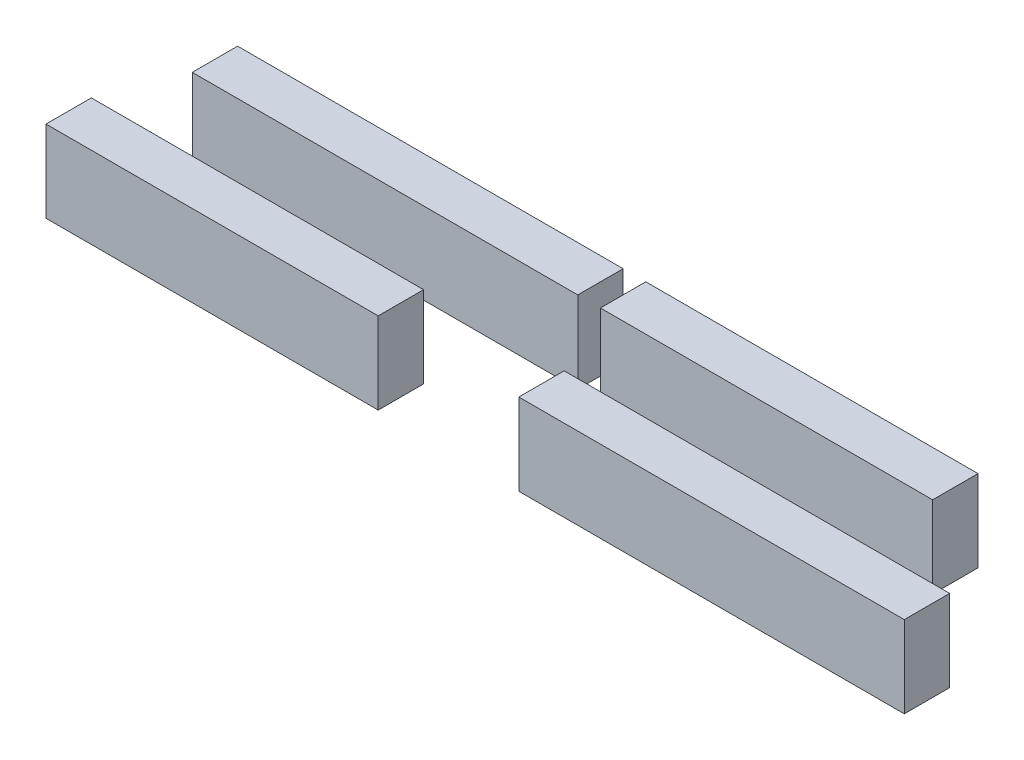
ISO-10303-21;
HEADER;
FILE_DESCRIPTION(('STEP AP214'),'2;1');
FILE_NAME('part.step','',(''),(''),'','','');
FILE_SCHEMA(('AUTOMOTIVE_DESIGN { 1 0 10303 214 1 1 1 1 }'));
ENDSEC;
DATA;
#1=APPLICATION_CONTEXT('core data for automotive mechanical design processes');
#2=APPLICATION_PROTOCOL_DEFINITION('international standard','automotive_design',2000,#1);
#3=PRODUCT_CONTEXT('',#1,'mechanical');
#4=PRODUCT('Part','Part','',(#3));
#5=PRODUCT_RELATED_PRODUCT_CATEGORY('part','',(#4));
#6=PRODUCT_DEFINITION_FORMATION('','',#4);
#7=PRODUCT_DEFINITION_CONTEXT('part definition',#1,'design');
#8=PRODUCT_DEFINITION('design','',#6,#7);
#9=PRODUCT_DEFINITION_SHAPE('','',#8);
#10=(LENGTH_UNIT() NAMED_UNIT(*) SI_UNIT(.MILLI.,.METRE.));
#11=(NAMED_UNIT(*) PLANE_ANGLE_UNIT() SI_UNIT($,.RADIAN.));
#12=(NAMED_UNIT(*) SI_UNIT($,.STERADIAN.) SOLID_ANGLE_UNIT());
#13=UNCERTAINTY_MEASURE_WITH_UNIT(LENGTH_MEASURE(1.E-05),#10,'distance_accuracy_value','');
#14=(GEOMETRIC_REPRESENTATION_CONTEXT(3) GLOBAL_UNCERTAINTY_ASSIGNED_CONTEXT((#13)) GLOBAL_UNIT_ASSIGNED_CONTEXT((#10,
#11,#12)) REPRESENTATION_CONTEXT('',''));
#15=CARTESIAN_POINT('',(0.,0.,0.));
#16=DIRECTION('',(0.,0.,1.));
#17=DIRECTION('',(1.,0.,0.));
#18=AXIS2_PLACEMENT_3D('',#15,#16,#17);
#19=CARTESIAN_POINT('',(50.75,9.,-22.5));
#20=DIRECTION('',(1.,0.,0.));
#21=DIRECTION('',(0.,0.,-1.));
#22=AXIS2_PLACEMENT_3D('',#19,#20,#21);
#23=PLANE('',#22);
#24=DIRECTION('',(0.,0.,1.));
#25=VECTOR('',#24,1.);
#26=CARTESIAN_POINT('',(50.75,0.,-22.5));
#27=LINE('',#26,#25);
#28=CARTESIAN_POINT('',(50.75,0.,-22.5));
#29=VERTEX_POINT('',#28);
#30=CARTESIAN_POINT('',(50.75,0.,-17.5));
#31=VERTEX_POINT('',#30);
#32=EDGE_CURVE('E107',#29,#31,#27,.T.);
#33=ORIENTED_EDGE('',*,*,#32,.T.);
#34=DIRECTION('',(0.,-1.,0.));
#35=VECTOR('',#34,1.);
#36=CARTESIAN_POINT('',(50.75,9.,-17.5));
#37=LINE('',#36,#35);
#38=CARTESIAN_POINT('',(50.75,9.,-17.5));
#39=VERTEX_POINT('',#38);
#40=EDGE_CURVE('E12',#39,#31,#37,.T.);
#41=ORIENTED_EDGE('',*,*,#40,.F.);
#42=DIRECTION('',(0.,0.,1.));
#43=VECTOR('',#42,1.);
#44=CARTESIAN_POINT('',(50.75,9.,-22.5));
#45=LINE('',#44,#43);
#46=CARTESIAN_POINT('',(50.75,9.,-22.5));
#47=VERTEX_POINT('',#46);
#48=EDGE_CURVE('E95',#47,#39,#45,.T.);
#49=ORIENTED_EDGE('',*,*,#48,.F.);
#50=DIRECTION('',(0.,-1.,0.));
#51=VECTOR('',#50,1.);
#52=CARTESIAN_POINT('',(50.75,9.,-22.5));
#53=LINE('',#52,#51);
#54=EDGE_CURVE('E103',#47,#29,#53,.T.);
#55=ORIENTED_EDGE('',*,*,#54,.T.);
#56=EDGE_LOOP('',(#33,#41,#49,#55));
#57=FACE_BOUND('',#56,.T.);
#58=ADVANCED_FACE('F44',(#57),#23,.F.);
#59=CARTESIAN_POINT('',(50.75,9.,-17.5));
#60=DIRECTION('',(0.,0.,-1.));
#61=DIRECTION('',(-1.,0.,0.));
#62=AXIS2_PLACEMENT_3D('',#59,#60,#61);
#63=PLANE('',#62);
#64=DIRECTION('',(1.,0.,0.));
#65=VECTOR('',#64,1.);
#66=CARTESIAN_POINT('',(50.75,0.,-17.5));
#67=LINE('',#66,#65);
#68=CARTESIAN_POINT('',(87.375,0.,-17.5));
#69=VERTEX_POINT('',#68);
#70=EDGE_CURVE('E99',#31,#69,#67,.T.);
#71=ORIENTED_EDGE('',*,*,#70,.T.);
#72=DIRECTION('',(0.,-1.,0.));
#73=VECTOR('',#72,1.);
#74=CARTESIAN_POINT('',(87.375,9.,-17.5));
#75=LINE('',#74,#73);
#76=CARTESIAN_POINT('',(87.375,9.,-17.5));
#77=VERTEX_POINT('',#76);
#78=EDGE_CURVE('E52',#77,#69,#75,.T.);
#79=ORIENTED_EDGE('',*,*,#78,.F.);
#80=DIRECTION('',(1.,0.,0.));
#81=VECTOR('',#80,1.);
#82=CARTESIAN_POINT('',(50.75,9.,-17.5));
#83=LINE('',#82,#81);
#84=EDGE_CURVE('E90',#39,#77,#83,.T.);
#85=ORIENTED_EDGE('',*,*,#84,.F.);
#86=ORIENTED_EDGE('',*,*,#40,.T.);
#87=EDGE_LOOP('',(#71,#79,#85,#86));
#88=FACE_BOUND('',#87,.T.);
#89=ADVANCED_FACE('F98',(#88),#63,.F.);
#90=CARTESIAN_POINT('',(87.375,9.,-22.5));
#91=DIRECTION('',(-1.,0.,0.));
#92=DIRECTION('',(0.,0.,1.));
#93=AXIS2_PLACEMENT_3D('',#90,#91,#92);
#94=PLANE('',#93);
#95=DIRECTION('',(0.,0.,-1.));
#96=VECTOR('',#95,1.);
#97=CARTESIAN_POINT('',(87.375,0.,-22.5));
#98=LINE('',#97,#96);
#99=CARTESIAN_POINT('',(87.375,0.,-22.5));
#100=VERTEX_POINT('',#99);
#101=EDGE_CURVE('E77',#69,#100,#98,.T.);
#102=ORIENTED_EDGE('',*,*,#101,.T.);
#103=DIRECTION('',(0.,-1.,0.));
#104=VECTOR('',#103,1.);
#105=CARTESIAN_POINT('',(87.375,9.,-22.5));
#106=LINE('',#105,#104);
#107=CARTESIAN_POINT('',(87.375,9.,-22.5));
#108=VERTEX_POINT('',#107);
#109=EDGE_CURVE('E100',#108,#100,#106,.T.);
#110=ORIENTED_EDGE('',*,*,#109,.F.);
#111=DIRECTION('',(0.,0.,-1.));
#112=VECTOR('',#111,1.);
#113=CARTESIAN_POINT('',(87.375,9.,-22.5));
#114=LINE('',#113,#112);
#115=EDGE_CURVE('E93',#77,#108,#114,.T.);
#116=ORIENTED_EDGE('',*,*,#115,.F.);
#117=ORIENTED_EDGE('',*,*,#78,.T.);
#118=EDGE_LOOP('',(#102,#110,#116,#117));
#119=FACE_BOUND('',#118,.T.);
#120=ADVANCED_FACE('F101',(#119),#94,.F.);
#121=CARTESIAN_POINT('',(50.75,9.,-22.5));
#122=DIRECTION('',(0.,0.,1.));
#123=DIRECTION('',(1.,0.,0.));
#124=AXIS2_PLACEMENT_3D('',#121,#122,#123);
#125=PLANE('',#124);
#126=DIRECTION('',(-1.,0.,0.));
#127=VECTOR('',#126,1.);
#128=CARTESIAN_POINT('',(50.75,0.,-22.5));
#129=LINE('',#128,#127);
#130=EDGE_CURVE('E83',#100,#29,#129,.T.);
#131=ORIENTED_EDGE('',*,*,#130,.T.);
#132=ORIENTED_EDGE('',*,*,#54,.F.);
#133=DIRECTION('',(-1.,0.,0.));
#134=VECTOR('',#133,1.);
#135=CARTESIAN_POINT('',(50.75,9.,-22.5));
#136=LINE('',#135,#134);
#137=EDGE_CURVE('E60',#108,#47,#136,.T.);
#138=ORIENTED_EDGE('',*,*,#137,.F.);
#139=ORIENTED_EDGE('',*,*,#109,.T.);
#140=EDGE_LOOP('',(#131,#132,#138,#139));
#141=FACE_BOUND('',#140,.T.);
#142=ADVANCED_FACE('F114',(#141),#125,.F.);
#143=CARTESIAN_POINT('',(50.75,9.,-17.5));
#144=DIRECTION('',(0.,1.,0.));
#145=DIRECTION('',(0.,0.,1.));
#146=AXIS2_PLACEMENT_3D('',#143,#144,#145);
#147=PLANE('',#146);
#148=ORIENTED_EDGE('',*,*,#48,.T.);
#149=ORIENTED_EDGE('',*,*,#84,.T.);
#150=ORIENTED_EDGE('',*,*,#115,.T.);
#151=ORIENTED_EDGE('',*,*,#137,.T.);
#152=EDGE_LOOP('',(#148,#149,#150,#151));
#153=FACE_BOUND('',#152,.T.);
#154=ADVANCED_FACE('F91',(#153),#147,.T.);
#155=CARTESIAN_POINT('',(50.75,0.,-17.5));
#156=DIRECTION('',(0.,1.,0.));
#157=DIRECTION('',(0.,0.,1.));
#158=AXIS2_PLACEMENT_3D('',#155,#156,#157);
#159=PLANE('',#158);
#160=ORIENTED_EDGE('',*,*,#32,.F.);
#161=ORIENTED_EDGE('',*,*,#130,.F.);
#162=ORIENTED_EDGE('',*,*,#101,.F.);
#163=ORIENTED_EDGE('',*,*,#70,.F.);
#164=EDGE_LOOP('',(#160,#161,#162,#163));
#165=FACE_BOUND('',#164,.T.);
#166=ADVANCED_FACE('F117',(#165),#159,.F.);
#167=CLOSED_SHELL('',(#58,#89,#120,#142,#154,#166));
#168=MANIFOLD_SOLID_BREP('B2',#167);
#169=CARTESIAN_POINT('',(5.75,9.,-22.5));
#170=DIRECTION('',(1.,0.,0.));
#171=DIRECTION('',(0.,0.,-1.));
#172=AXIS2_PLACEMENT_3D('',#169,#170,#171);
#173=PLANE('',#172);
#174=DIRECTION('',(0.,0.,1.));
#175=VECTOR('',#174,1.);
#176=CARTESIAN_POINT('',(5.75,0.,-22.5));
#177=LINE('',#176,#175);
#178=CARTESIAN_POINT('',(5.75,0.,-22.5));
#179=VERTEX_POINT('',#178);
#180=CARTESIAN_POINT('',(5.75,0.,-17.5));
#181=VERTEX_POINT('',#180);
#182=EDGE_CURVE('E241',#179,#181,#177,.T.);
#183=ORIENTED_EDGE('',*,*,#182,.T.);
#184=DIRECTION('',(0.,-1.,0.));
#185=VECTOR('',#184,1.);
#186=CARTESIAN_POINT('',(5.75,9.,-17.5));
#187=LINE('',#186,#185);
#188=CARTESIAN_POINT('',(5.75,9.,-17.5));
#189=VERTEX_POINT('',#188);
#190=EDGE_CURVE('E42',#189,#181,#187,.T.);
#191=ORIENTED_EDGE('',*,*,#190,.F.);
#192=DIRECTION('',(0.,0.,1.));
#193=VECTOR('',#192,1.);
#194=CARTESIAN_POINT('',(5.75,9.,-22.5));
#195=LINE('',#194,#193);
#196=CARTESIAN_POINT('',(5.75,9.,-22.5));
#197=VERTEX_POINT('',#196);
#198=EDGE_CURVE('E229',#197,#189,#195,.T.);
#199=ORIENTED_EDGE('',*,*,#198,.F.);
#200=DIRECTION('',(0.,-1.,0.));
#201=VECTOR('',#200,1.);
#202=CARTESIAN_POINT('',(5.75,9.,-22.5));
#203=LINE('',#202,#201);
#204=EDGE_CURVE('E237',#197,#179,#203,.T.);
#205=ORIENTED_EDGE('',*,*,#204,.T.);
#206=EDGE_LOOP('',(#183,#191,#199,#205));
#207=FACE_BOUND('',#206,.T.);
#208=ADVANCED_FACE('F178',(#207),#173,.F.);
#209=CARTESIAN_POINT('',(5.75,9.,-17.5));
#210=DIRECTION('',(0.,0.,-1.));
#211=DIRECTION('',(-1.,0.,0.));
#212=AXIS2_PLACEMENT_3D('',#209,#210,#211);
#213=PLANE('',#212);
#214=DIRECTION('',(1.,0.,0.));
#215=VECTOR('',#214,1.);
#216=CARTESIAN_POINT('',(5.75,0.,-17.5));
#217=LINE('',#216,#215);
#218=CARTESIAN_POINT('',(48.25,0.,-17.5));
#219=VERTEX_POINT('',#218);
#220=EDGE_CURVE('E233',#181,#219,#217,.T.);
#221=ORIENTED_EDGE('',*,*,#220,.T.);
#222=DIRECTION('',(0.,-1.,0.));
#223=VECTOR('',#222,1.);
#224=CARTESIAN_POINT('',(48.25,9.,-17.5));
#225=LINE('',#224,#223);
#226=CARTESIAN_POINT('',(48.25,9.,-17.5));
#227=VERTEX_POINT('',#226);
#228=EDGE_CURVE('E186',#227,#219,#225,.T.);
#229=ORIENTED_EDGE('',*,*,#228,.F.);
#230=DIRECTION('',(1.,0.,0.));
#231=VECTOR('',#230,1.);
#232=CARTESIAN_POINT('',(5.75,9.,-17.5));
#233=LINE('',#232,#231);
#234=EDGE_CURVE('E224',#189,#227,#233,.T.);
#235=ORIENTED_EDGE('',*,*,#234,.F.);
#236=ORIENTED_EDGE('',*,*,#190,.T.);
#237=EDGE_LOOP('',(#221,#229,#235,#236));
#238=FACE_BOUND('',#237,.T.);
#239=ADVANCED_FACE('F232',(#238),#213,.F.);
#240=CARTESIAN_POINT('',(48.25,9.,-22.5));
#241=DIRECTION('',(-1.,0.,0.));
#242=DIRECTION('',(0.,0.,1.));
#243=AXIS2_PLACEMENT_3D('',#240,#241,#242);
#244=PLANE('',#243);
#245=DIRECTION('',(0.,0.,-1.));
#246=VECTOR('',#245,1.);
#247=CARTESIAN_POINT('',(48.25,0.,-22.5));
#248=LINE('',#247,#246);
#249=CARTESIAN_POINT('',(48.25,0.,-22.5));
#250=VERTEX_POINT('',#249);
#251=EDGE_CURVE('E211',#219,#250,#248,.T.);
#252=ORIENTED_EDGE('',*,*,#251,.T.);
#253=DIRECTION('',(0.,-1.,0.));
#254=VECTOR('',#253,1.);
#255=CARTESIAN_POINT('',(48.25,9.,-22.5));
#256=LINE('',#255,#254);
#257=CARTESIAN_POINT('',(48.25,9.,-22.5));
#258=VERTEX_POINT('',#257);
#259=EDGE_CURVE('E234',#258,#250,#256,.T.);
#260=ORIENTED_EDGE('',*,*,#259,.F.);
#261=DIRECTION('',(0.,0.,-1.));
#262=VECTOR('',#261,1.);
#263=CARTESIAN_POINT('',(48.25,9.,-22.5));
#264=LINE('',#263,#262);
#265=EDGE_CURVE('E227',#227,#258,#264,.T.);
#266=ORIENTED_EDGE('',*,*,#265,.F.);
#267=ORIENTED_EDGE('',*,*,#228,.T.);
#268=EDGE_LOOP('',(#252,#260,#266,#267));
#269=FACE_BOUND('',#268,.T.);
#270=ADVANCED_FACE('F235',(#269),#244,.F.);
#271=CARTESIAN_POINT('',(5.75,9.,-22.5));
#272=DIRECTION('',(0.,0.,1.));
#273=DIRECTION('',(1.,0.,0.));
#274=AXIS2_PLACEMENT_3D('',#271,#272,#273);
#275=PLANE('',#274);
#276=DIRECTION('',(-1.,0.,0.));
#277=VECTOR('',#276,1.);
#278=CARTESIAN_POINT('',(5.75,0.,-22.5));
#279=LINE('',#278,#277);
#280=EDGE_CURVE('E217',#250,#179,#279,.T.);
#281=ORIENTED_EDGE('',*,*,#280,.T.);
#282=ORIENTED_EDGE('',*,*,#204,.F.);
#283=DIRECTION('',(-1.,0.,0.));
#284=VECTOR('',#283,1.);
#285=CARTESIAN_POINT('',(5.75,9.,-22.5));
#286=LINE('',#285,#284);
#287=EDGE_CURVE('E194',#258,#197,#286,.T.);
#288=ORIENTED_EDGE('',*,*,#287,.F.);
#289=ORIENTED_EDGE('',*,*,#259,.T.);
#290=EDGE_LOOP('',(#281,#282,#288,#289));
#291=FACE_BOUND('',#290,.T.);
#292=ADVANCED_FACE('F248',(#291),#275,.F.);
#293=CARTESIAN_POINT('',(5.75,9.,-17.5));
#294=DIRECTION('',(0.,1.,0.));
#295=DIRECTION('',(0.,0.,1.));
#296=AXIS2_PLACEMENT_3D('',#293,#294,#295);
#297=PLANE('',#296);
#298=ORIENTED_EDGE('',*,*,#198,.T.);
#299=ORIENTED_EDGE('',*,*,#234,.T.);
#300=ORIENTED_EDGE('',*,*,#265,.T.);
#301=ORIENTED_EDGE('',*,*,#287,.T.);
#302=EDGE_LOOP('',(#298,#299,#300,#301));
#303=FACE_BOUND('',#302,.T.);
#304=ADVANCED_FACE('F225',(#303),#297,.T.);
#305=CARTESIAN_POINT('',(5.75,0.,-17.5));
#306=DIRECTION('',(0.,1.,0.));
#307=DIRECTION('',(0.,0.,1.));
#308=AXIS2_PLACEMENT_3D('',#305,#306,#307);
#309=PLANE('',#308);
#310=ORIENTED_EDGE('',*,*,#182,.F.);
#311=ORIENTED_EDGE('',*,*,#280,.F.);
#312=ORIENTED_EDGE('',*,*,#251,.F.);
#313=ORIENTED_EDGE('',*,*,#220,.F.);
#314=EDGE_LOOP('',(#310,#311,#312,#313));
#315=FACE_BOUND('',#314,.T.);
#316=ADVANCED_FACE('F251',(#315),#309,.F.);
#317=CLOSED_SHELL('',(#208,#239,#270,#292,#304,#316));
#318=MANIFOLD_SOLID_BREP('B6',#317);
#319=CARTESIAN_POINT('',(54.75,9.,-9.5));
#320=DIRECTION('',(1.,0.,0.));
#321=DIRECTION('',(0.,0.,-1.));
#322=AXIS2_PLACEMENT_3D('',#319,#320,#321);
#323=PLANE('',#322);
#324=DIRECTION('',(0.,0.,1.));
#325=VECTOR('',#324,1.);
#326=CARTESIAN_POINT('',(54.75,0.,-9.5));
#327=LINE('',#326,#325);
#328=CARTESIAN_POINT('',(54.75,0.,-9.5));
#329=VERTEX_POINT('',#328);
#330=CARTESIAN_POINT('',(54.75,0.,-4.5));
#331=VERTEX_POINT('',#330);
#332=EDGE_CURVE('E374',#329,#331,#327,.T.);
#333=ORIENTED_EDGE('',*,*,#332,.T.);
#334=DIRECTION('',(0.,-1.,0.));
#335=VECTOR('',#334,1.);
#336=CARTESIAN_POINT('',(54.75,9.,-4.5));
#337=LINE('',#336,#335);
#338=CARTESIAN_POINT('',(54.75,9.,-4.5));
#339=VERTEX_POINT('',#338);
#340=EDGE_CURVE('E176',#339,#331,#337,.T.);
#341=ORIENTED_EDGE('',*,*,#340,.F.);
#342=DIRECTION('',(0.,0.,1.));
#343=VECTOR('',#342,1.);
#344=CARTESIAN_POINT('',(54.75,9.,-9.5));
#345=LINE('',#344,#343);
#346=CARTESIAN_POINT('',(54.75,9.,-9.5));
#347=VERTEX_POINT('',#346);
#348=EDGE_CURVE('E362',#347,#339,#345,.T.);
#349=ORIENTED_EDGE('',*,*,#348,.F.);
#350=DIRECTION('',(0.,-1.,0.));
#351=VECTOR('',#350,1.);
#352=CARTESIAN_POINT('',(54.75,9.,-9.5));
#353=LINE('',#352,#351);
#354=EDGE_CURVE('E370',#347,#329,#353,.T.);
#355=ORIENTED_EDGE('',*,*,#354,.T.);
#356=EDGE_LOOP('',(#333,#341,#349,#355));
#357=FACE_BOUND('',#356,.T.);
#358=ADVANCED_FACE('F311',(#357),#323,.F.);
#359=CARTESIAN_POINT('',(54.75,9.,-4.5));
#360=DIRECTION('',(0.,0.,-1.));
#361=DIRECTION('',(-1.,0.,0.));
#362=AXIS2_PLACEMENT_3D('',#359,#360,#361);
#363=PLANE('',#362);
#364=DIRECTION('',(1.,0.,0.));
#365=VECTOR('',#364,1.);
#366=CARTESIAN_POINT('',(54.75,0.,-4.5));
#367=LINE('',#366,#365);
#368=CARTESIAN_POINT('',(97.25,0.,-4.5));
#369=VERTEX_POINT('',#368);
#370=EDGE_CURVE('E366',#331,#369,#367,.T.);
#371=ORIENTED_EDGE('',*,*,#370,.T.);
#372=DIRECTION('',(0.,-1.,0.));
#373=VECTOR('',#372,1.);
#374=CARTESIAN_POINT('',(97.25,9.,-4.5));
#375=LINE('',#374,#373);
#376=CARTESIAN_POINT('',(97.25,9.,-4.5));
#377=VERTEX_POINT('',#376);
#378=EDGE_CURVE('E319',#377,#369,#375,.T.);
#379=ORIENTED_EDGE('',*,*,#378,.F.);
#380=DIRECTION('',(1.,0.,0.));
#381=VECTOR('',#380,1.);
#382=CARTESIAN_POINT('',(54.75,9.,-4.5));
#383=LINE('',#382,#381);
#384=EDGE_CURVE('E357',#339,#377,#383,.T.);
#385=ORIENTED_EDGE('',*,*,#384,.F.);
#386=ORIENTED_EDGE('',*,*,#340,.T.);
#387=EDGE_LOOP('',(#371,#379,#385,#386));
#388=FACE_BOUND('',#387,.T.);
#389=ADVANCED_FACE('F365',(#388),#363,.F.);
#390=CARTESIAN_POINT('',(97.25,9.,-9.5));
#391=DIRECTION('',(-1.,0.,0.));
#392=DIRECTION('',(0.,0.,1.));
#393=AXIS2_PLACEMENT_3D('',#390,#391,#392);
#394=PLANE('',#393);
#395=DIRECTION('',(0.,0.,-1.));
#396=VECTOR('',#395,1.);
#397=CARTESIAN_POINT('',(97.25,0.,-9.5));
#398=LINE('',#397,#396);
#399=CARTESIAN_POINT('',(97.25,0.,-9.5));
#400=VERTEX_POINT('',#399);
#401=EDGE_CURVE('E344',#369,#400,#398,.T.);
#402=ORIENTED_EDGE('',*,*,#401,.T.);
#403=DIRECTION('',(0.,-1.,0.));
#404=VECTOR('',#403,1.);
#405=CARTESIAN_POINT('',(97.25,9.,-9.5));
#406=LINE('',#405,#404);
#407=CARTESIAN_POINT('',(97.25,9.,-9.5));
#408=VERTEX_POINT('',#407);
#409=EDGE_CURVE('E367',#408,#400,#406,.T.);
#410=ORIENTED_EDGE('',*,*,#409,.F.);
#411=DIRECTION('',(0.,0.,-1.));
#412=VECTOR('',#411,1.);
#413=CARTESIAN_POINT('',(97.25,9.,-9.5));
#414=LINE('',#413,#412);
#415=EDGE_CURVE('E360',#377,#408,#414,.T.);
#416=ORIENTED_EDGE('',*,*,#415,.F.);
#417=ORIENTED_EDGE('',*,*,#378,.T.);
#418=EDGE_LOOP('',(#402,#410,#416,#417));
#419=FACE_BOUND('',#418,.T.);
#420=ADVANCED_FACE('F368',(#419),#394,.F.);
#421=CARTESIAN_POINT('',(54.75,9.,-9.5));
#422=DIRECTION('',(0.,0.,1.));
#423=DIRECTION('',(1.,0.,0.));
#424=AXIS2_PLACEMENT_3D('',#421,#422,#423);
#425=PLANE('',#424);
#426=DIRECTION('',(-1.,0.,0.));
#427=VECTOR('',#426,1.);
#428=CARTESIAN_POINT('',(54.75,0.,-9.5));
#429=LINE('',#428,#427);
#430=EDGE_CURVE('E350',#400,#329,#429,.T.);
#431=ORIENTED_EDGE('',*,*,#430,.T.);
#432=ORIENTED_EDGE('',*,*,#354,.F.);
#433=DIRECTION('',(-1.,0.,0.));
#434=VECTOR('',#433,1.);
#435=CARTESIAN_POINT('',(54.75,9.,-9.5));
#436=LINE('',#435,#434);
#437=EDGE_CURVE('E327',#408,#347,#436,.T.);
#438=ORIENTED_EDGE('',*,*,#437,.F.);
#439=ORIENTED_EDGE('',*,*,#409,.T.);
#440=EDGE_LOOP('',(#431,#432,#438,#439));
#441=FACE_BOUND('',#440,.T.);
#442=ADVANCED_FACE('F381',(#441),#425,.F.);
#443=CARTESIAN_POINT('',(54.75,9.,-4.5));
#444=DIRECTION('',(0.,1.,0.));
#445=DIRECTION('',(0.,0.,1.));
#446=AXIS2_PLACEMENT_3D('',#443,#444,#445);
#447=PLANE('',#446);
#448=ORIENTED_EDGE('',*,*,#348,.T.);
#449=ORIENTED_EDGE('',*,*,#384,.T.);
#450=ORIENTED_EDGE('',*,*,#415,.T.);
#451=ORIENTED_EDGE('',*,*,#437,.T.);
#452=EDGE_LOOP('',(#448,#449,#450,#451));
#453=FACE_BOUND('',#452,.T.);
#454=ADVANCED_FACE('F358',(#453),#447,.T.);
#455=CARTESIAN_POINT('',(54.75,0.,-4.5));
#456=DIRECTION('',(0.,1.,0.));
#457=DIRECTION('',(0.,0.,1.));
#458=AXIS2_PLACEMENT_3D('',#455,#456,#457);
#459=PLANE('',#458);
#460=ORIENTED_EDGE('',*,*,#332,.F.);
#461=ORIENTED_EDGE('',*,*,#430,.F.);
#462=ORIENTED_EDGE('',*,*,#401,.F.);
#463=ORIENTED_EDGE('',*,*,#370,.F.);
#464=EDGE_LOOP('',(#460,#461,#462,#463));
#465=FACE_BOUND('',#464,.T.);
#466=ADVANCED_FACE('F384',(#465),#459,.F.);
#467=CLOSED_SHELL('',(#358,#389,#420,#442,#454,#466));
#468=MANIFOLD_SOLID_BREP('B36',#467);
#469=CARTESIAN_POINT('',(2.625,9.,-9.5));
#470=DIRECTION('',(1.,0.,0.));
#471=DIRECTION('',(0.,0.,-1.));
#472=AXIS2_PLACEMENT_3D('',#469,#470,#471);
#473=PLANE('',#472);
#474=DIRECTION('',(0.,0.,1.));
#475=VECTOR('',#474,1.);
#476=CARTESIAN_POINT('',(2.625,0.,-9.5));
#477=LINE('',#476,#475);
#478=CARTESIAN_POINT('',(2.625,0.,-9.5));
#479=VERTEX_POINT('',#478);
#480=CARTESIAN_POINT('',(2.625,0.,-4.5));
#481=VERTEX_POINT('',#480);
#482=EDGE_CURVE('E498',#479,#481,#477,.T.);
#483=ORIENTED_EDGE('',*,*,#482,.T.);
#484=DIRECTION('',(0.,-1.,0.));
#485=VECTOR('',#484,1.);
#486=CARTESIAN_POINT('',(2.625,9.,-4.5));
#487=LINE('',#486,#485);
#488=CARTESIAN_POINT('',(2.625,9.,-4.5));
#489=VERTEX_POINT('',#488);
#490=EDGE_CURVE('E309',#489,#481,#487,.T.);
#491=ORIENTED_EDGE('',*,*,#490,.F.);
#492=DIRECTION('',(0.,0.,1.));
#493=VECTOR('',#492,1.);
#494=CARTESIAN_POINT('',(2.625,9.,-9.5));
#495=LINE('',#494,#493);
#496=CARTESIAN_POINT('',(2.625,9.,-9.5));
#497=VERTEX_POINT('',#496);
#498=EDGE_CURVE('E486',#497,#489,#495,.T.);
#499=ORIENTED_EDGE('',*,*,#498,.F.);
#500=DIRECTION('',(0.,-1.,0.));
#501=VECTOR('',#500,1.);
#502=CARTESIAN_POINT('',(2.625,9.,-9.5));
#503=LINE('',#502,#501);
#504=EDGE_CURVE('E494',#497,#479,#503,.T.);
#505=ORIENTED_EDGE('',*,*,#504,.T.);
#506=EDGE_LOOP('',(#483,#491,#499,#505));
#507=FACE_BOUND('',#506,.T.);
#508=ADVANCED_FACE('F435',(#507),#473,.F.);
#509=CARTESIAN_POINT('',(2.625,9.,-4.5));
#510=DIRECTION('',(0.,0.,-1.));
#511=DIRECTION('',(-1.,0.,0.));
#512=AXIS2_PLACEMENT_3D('',#509,#510,#511);
#513=PLANE('',#512);
#514=DIRECTION('',(1.,0.,0.));
#515=VECTOR('',#514,1.);
#516=CARTESIAN_POINT('',(2.625,0.,-4.5));
#517=LINE('',#516,#515);
#518=CARTESIAN_POINT('',(39.25,0.,-4.5));
#519=VERTEX_POINT('',#518);
#520=EDGE_CURVE('E490',#481,#519,#517,.T.);
#521=ORIENTED_EDGE('',*,*,#520,.T.);
#522=DIRECTION('',(0.,-1.,0.));
#523=VECTOR('',#522,1.);
#524=CARTESIAN_POINT('',(39.25,9.,-4.5));
#525=LINE('',#524,#523);
#526=CARTESIAN_POINT('',(39.25,9.,-4.5));
#527=VERTEX_POINT('',#526);
#528=EDGE_CURVE('E443',#527,#519,#525,.T.);
#529=ORIENTED_EDGE('',*,*,#528,.F.);
#530=DIRECTION('',(1.,0.,0.));
#531=VECTOR('',#530,1.);
#532=CARTESIAN_POINT('',(2.625,9.,-4.5));
#533=LINE('',#532,#531);
#534=EDGE_CURVE('E481',#489,#527,#533,.T.);
#535=ORIENTED_EDGE('',*,*,#534,.F.);
#536=ORIENTED_EDGE('',*,*,#490,.T.);
#537=EDGE_LOOP('',(#521,#529,#535,#536));
#538=FACE_BOUND('',#537,.T.);
#539=ADVANCED_FACE('F489',(#538),#513,.F.);
#540=CARTESIAN_POINT('',(39.25,9.,-9.5));
#541=DIRECTION('',(-1.,0.,0.));
#542=DIRECTION('',(0.,0.,1.));
#543=AXIS2_PLACEMENT_3D('',#540,#541,#542);
#544=PLANE('',#543);
#545=DIRECTION('',(0.,0.,-1.));
#546=VECTOR('',#545,1.);
#547=CARTESIAN_POINT('',(39.25,0.,-9.5));
#548=LINE('',#547,#546);
#549=CARTESIAN_POINT('',(39.25,0.,-9.5));
#550=VERTEX_POINT('',#549);
#551=EDGE_CURVE('E468',#519,#550,#548,.T.);
#552=ORIENTED_EDGE('',*,*,#551,.T.);
#553=DIRECTION('',(0.,-1.,0.));
#554=VECTOR('',#553,1.);
#555=CARTESIAN_POINT('',(39.25,9.,-9.5));
#556=LINE('',#555,#554);
#557=CARTESIAN_POINT('',(39.25,9.,-9.5));
#558=VERTEX_POINT('',#557);
#559=EDGE_CURVE('E491',#558,#550,#556,.T.);
#560=ORIENTED_EDGE('',*,*,#559,.F.);
#561=DIRECTION('',(0.,0.,-1.));
#562=VECTOR('',#561,1.);
#563=CARTESIAN_POINT('',(39.25,9.,-9.5));
#564=LINE('',#563,#562);
#565=EDGE_CURVE('E484',#527,#558,#564,.T.);
#566=ORIENTED_EDGE('',*,*,#565,.F.);
#567=ORIENTED_EDGE('',*,*,#528,.T.);
#568=EDGE_LOOP('',(#552,#560,#566,#567));
#569=FACE_BOUND('',#568,.T.);
#570=ADVANCED_FACE('F492',(#569),#544,.F.);
#571=CARTESIAN_POINT('',(2.625,9.,-9.5));
#572=DIRECTION('',(0.,0.,1.));
#573=DIRECTION('',(1.,0.,0.));
#574=AXIS2_PLACEMENT_3D('',#571,#572,#573);
#575=PLANE('',#574);
#576=DIRECTION('',(-1.,0.,0.));
#577=VECTOR('',#576,1.);
#578=CARTESIAN_POINT('',(2.625,0.,-9.5));
#579=LINE('',#578,#577);
#580=EDGE_CURVE('E474',#550,#479,#579,.T.);
#581=ORIENTED_EDGE('',*,*,#580,.T.);
#582=ORIENTED_EDGE('',*,*,#504,.F.);
#583=DIRECTION('',(-1.,0.,0.));
#584=VECTOR('',#583,1.);
#585=CARTESIAN_POINT('',(2.625,9.,-9.5));
#586=LINE('',#585,#584);
#587=EDGE_CURVE('E451',#558,#497,#586,.T.);
#588=ORIENTED_EDGE('',*,*,#587,.F.);
#589=ORIENTED_EDGE('',*,*,#559,.T.);
#590=EDGE_LOOP('',(#581,#582,#588,#589));
#591=FACE_BOUND('',#590,.T.);
#592=ADVANCED_FACE('F505',(#591),#575,.F.);
#593=CARTESIAN_POINT('',(2.625,9.,-4.5));
#594=DIRECTION('',(0.,1.,0.));
#595=DIRECTION('',(0.,0.,1.));
#596=AXIS2_PLACEMENT_3D('',#593,#594,#595);
#597=PLANE('',#596);
#598=ORIENTED_EDGE('',*,*,#498,.T.);
#599=ORIENTED_EDGE('',*,*,#534,.T.);
#600=ORIENTED_EDGE('',*,*,#565,.T.);
#601=ORIENTED_EDGE('',*,*,#587,.T.);
#602=EDGE_LOOP('',(#598,#599,#600,#601));
#603=FACE_BOUND('',#602,.T.);
#604=ADVANCED_FACE('F482',(#603),#597,.T.);
#605=CARTESIAN_POINT('',(2.625,0.,-4.5));
#606=DIRECTION('',(0.,1.,0.));
#607=DIRECTION('',(0.,0.,1.));
#608=AXIS2_PLACEMENT_3D('',#605,#606,#607);
#609=PLANE('',#608);
#610=ORIENTED_EDGE('',*,*,#482,.F.);
#611=ORIENTED_EDGE('',*,*,#580,.F.);
#612=ORIENTED_EDGE('',*,*,#551,.F.);
#613=ORIENTED_EDGE('',*,*,#520,.F.);
#614=EDGE_LOOP('',(#610,#611,#612,#613));
#615=FACE_BOUND('',#614,.T.);
#616=ADVANCED_FACE('F508',(#615),#609,.F.);
#617=CLOSED_SHELL('',(#508,#539,#570,#592,#604,#616));
#618=MANIFOLD_SOLID_BREP('B170',#617);
#619=ADVANCED_BREP_SHAPE_REPRESENTATION('',(#18,#168,#318,#468,#618),#14);
#620=SHAPE_DEFINITION_REPRESENTATION(#9,#619);
ENDSEC;
END-ISO-10303-21;
